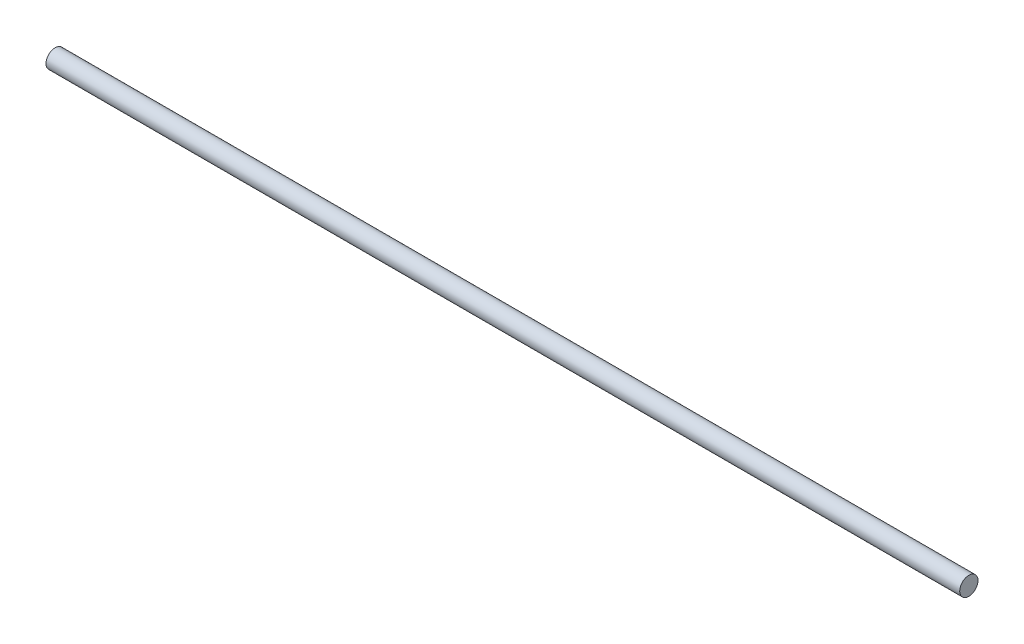
ISO-10303-21;
HEADER;
FILE_DESCRIPTION(('STEP AP214'),'2;1');
FILE_NAME('part.step','',(''),(''),'','','');
FILE_SCHEMA(('AUTOMOTIVE_DESIGN { 1 0 10303 214 1 1 1 1 }'));
ENDSEC;
DATA;
#1=APPLICATION_CONTEXT('core data for automotive mechanical design processes');
#2=APPLICATION_PROTOCOL_DEFINITION('international standard','automotive_design',2000,#1);
#3=PRODUCT_CONTEXT('',#1,'mechanical');
#4=PRODUCT('Part','Part','',(#3));
#5=PRODUCT_RELATED_PRODUCT_CATEGORY('part','',(#4));
#6=PRODUCT_DEFINITION_FORMATION('','',#4);
#7=PRODUCT_DEFINITION_CONTEXT('part definition',#1,'design');
#8=PRODUCT_DEFINITION('design','',#6,#7);
#9=PRODUCT_DEFINITION_SHAPE('','',#8);
#10=(LENGTH_UNIT() NAMED_UNIT(*) SI_UNIT(.MILLI.,.METRE.));
#11=(NAMED_UNIT(*) PLANE_ANGLE_UNIT() SI_UNIT($,.RADIAN.));
#12=(NAMED_UNIT(*) SI_UNIT($,.STERADIAN.) SOLID_ANGLE_UNIT());
#13=UNCERTAINTY_MEASURE_WITH_UNIT(LENGTH_MEASURE(1.E-05),#10,'distance_accuracy_value','');
#14=(GEOMETRIC_REPRESENTATION_CONTEXT(3) GLOBAL_UNCERTAINTY_ASSIGNED_CONTEXT((#13)) GLOBAL_UNIT_ASSIGNED_CONTEXT((#10,
#11,#12)) REPRESENTATION_CONTEXT('',''));
#15=CARTESIAN_POINT('',(0.,0.,0.));
#16=DIRECTION('',(0.,0.,1.));
#17=DIRECTION('',(1.,0.,0.));
#18=AXIS2_PLACEMENT_3D('',#15,#16,#17);
#19=CARTESIAN_POINT('',(150.,0.,0.));
#20=DIRECTION('',(-1.,0.,0.));
#21=DIRECTION('',(0.,0.,1.));
#22=AXIS2_PLACEMENT_3D('',#19,#20,#21);
#23=CYLINDRICAL_SURFACE('',#22,1.5);
#24=CARTESIAN_POINT('',(150.,0.,0.));
#25=DIRECTION('',(1.,0.,0.));
#26=DIRECTION('',(0.,0.,-1.));
#27=AXIS2_PLACEMENT_3D('',#24,#25,#26);
#28=CIRCLE('',#27,1.5);
#29=CARTESIAN_POINT('',(150.,0.,-1.5));
#30=VERTEX_POINT('',#29);
#31=EDGE_CURVE('E10',#30,#30,#28,.T.);
#32=ORIENTED_EDGE('',*,*,#31,.F.);
#33=EDGE_LOOP('',(#32));
#34=FACE_BOUND('',#33,.T.);
#35=CARTESIAN_POINT('',(0.,0.,0.));
#36=DIRECTION('',(1.,0.,0.));
#37=DIRECTION('',(0.,0.,-1.));
#38=AXIS2_PLACEMENT_3D('',#35,#36,#37);
#39=CIRCLE('',#38,1.5);
#40=CARTESIAN_POINT('',(0.,0.,-1.5));
#41=VERTEX_POINT('',#40);
#42=EDGE_CURVE('E32',#41,#41,#39,.T.);
#43=ORIENTED_EDGE('',*,*,#42,.T.);
#44=EDGE_LOOP('',(#43));
#45=FACE_BOUND('',#44,.T.);
#46=ADVANCED_FACE('F29',(#34,#45),#23,.T.);
#47=CARTESIAN_POINT('',(150.,0.,0.));
#48=DIRECTION('',(1.,0.,0.));
#49=DIRECTION('',(0.,0.,-1.));
#50=AXIS2_PLACEMENT_3D('',#47,#48,#49);
#51=PLANE('',#50);
#52=ORIENTED_EDGE('',*,*,#31,.T.);
#53=EDGE_LOOP('',(#52));
#54=FACE_BOUND('',#53,.T.);
#55=ADVANCED_FACE('F44',(#54),#51,.T.);
#56=CARTESIAN_POINT('',(0.,0.,0.));
#57=DIRECTION('',(1.,0.,0.));
#58=DIRECTION('',(0.,0.,-1.));
#59=AXIS2_PLACEMENT_3D('',#56,#57,#58);
#60=PLANE('',#59);
#61=ORIENTED_EDGE('',*,*,#42,.F.);
#62=EDGE_LOOP('',(#61));
#63=FACE_BOUND('',#62,.T.);
#64=ADVANCED_FACE('F42',(#63),#60,.F.);
#65=CLOSED_SHELL('',(#46,#55,#64));
#66=MANIFOLD_SOLID_BREP('B2',#65);
#67=ADVANCED_BREP_SHAPE_REPRESENTATION('',(#18,#66),#14);
#68=SHAPE_DEFINITION_REPRESENTATION(#9,#67);
ENDSEC;
END-ISO-10303-21;
